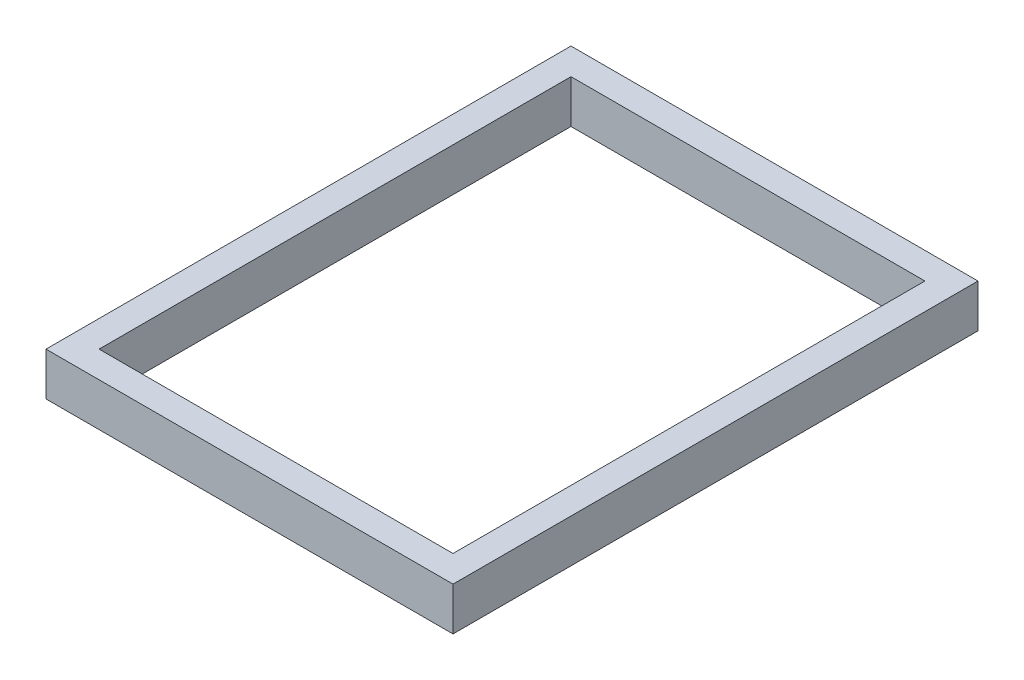
ISO-10303-21;
HEADER;
FILE_DESCRIPTION(('STEP AP214'),'2;1');
FILE_NAME('part.step','',(''),(''),'','','');
FILE_SCHEMA(('AUTOMOTIVE_DESIGN { 1 0 10303 214 1 1 1 1 }'));
ENDSEC;
DATA;
#1=APPLICATION_CONTEXT('core data for automotive mechanical design processes');
#2=APPLICATION_PROTOCOL_DEFINITION('international standard','automotive_design',2000,#1);
#3=PRODUCT_CONTEXT('',#1,'mechanical');
#4=PRODUCT('Part','Part','',(#3));
#5=PRODUCT_RELATED_PRODUCT_CATEGORY('part','',(#4));
#6=PRODUCT_DEFINITION_FORMATION('','',#4);
#7=PRODUCT_DEFINITION_CONTEXT('part definition',#1,'design');
#8=PRODUCT_DEFINITION('design','',#6,#7);
#9=PRODUCT_DEFINITION_SHAPE('','',#8);
#10=(LENGTH_UNIT() NAMED_UNIT(*) SI_UNIT(.MILLI.,.METRE.));
#11=(NAMED_UNIT(*) PLANE_ANGLE_UNIT() SI_UNIT($,.RADIAN.));
#12=(NAMED_UNIT(*) SI_UNIT($,.STERADIAN.) SOLID_ANGLE_UNIT());
#13=UNCERTAINTY_MEASURE_WITH_UNIT(LENGTH_MEASURE(1.E-05),#10,'distance_accuracy_value','');
#14=(GEOMETRIC_REPRESENTATION_CONTEXT(3) GLOBAL_UNCERTAINTY_ASSIGNED_CONTEXT((#13)) GLOBAL_UNIT_ASSIGNED_CONTEXT((#10,
#11,#12)) REPRESENTATION_CONTEXT('',''));
#15=CARTESIAN_POINT('',(0.,0.,0.));
#16=DIRECTION('',(0.,0.,1.));
#17=DIRECTION('',(1.,0.,0.));
#18=AXIS2_PLACEMENT_3D('',#15,#16,#17);
#19=CARTESIAN_POINT('',(0.,39.7764,-107.315));
#20=DIRECTION('',(0.,0.,1.));
#21=DIRECTION('',(1.,0.,0.));
#22=AXIS2_PLACEMENT_3D('',#19,#20,#21);
#23=PLANE('',#22);
#24=DIRECTION('',(-1.,0.,0.));
#25=VECTOR('',#24,1.);
#26=CARTESIAN_POINT('',(0.,30.48,-107.315));
#27=LINE('',#26,#25);
#28=CARTESIAN_POINT('',(81.915,30.48,-107.315));
#29=VERTEX_POINT('',#28);
#30=CARTESIAN_POINT('',(-5.71500000000001,30.48,-107.315));
#31=VERTEX_POINT('',#30);
#32=EDGE_CURVE('E143',#29,#31,#27,.T.);
#33=ORIENTED_EDGE('',*,*,#32,.T.);
#34=DIRECTION('',(0.,-1.,0.));
#35=VECTOR('',#34,1.);
#36=CARTESIAN_POINT('',(-5.71500000000001,39.7764,-107.315));
#37=LINE('',#36,#35);
#38=CARTESIAN_POINT('',(-5.71500000000001,39.7764,-107.315));
#39=VERTEX_POINT('',#38);
#40=EDGE_CURVE('E11',#39,#31,#37,.T.);
#41=ORIENTED_EDGE('',*,*,#40,.F.);
#42=DIRECTION('',(-1.,0.,0.));
#43=VECTOR('',#42,1.);
#44=CARTESIAN_POINT('',(0.,39.7764,-107.315));
#45=LINE('',#44,#43);
#46=CARTESIAN_POINT('',(81.915,39.7764,-107.315));
#47=VERTEX_POINT('',#46);
#48=EDGE_CURVE('E120',#47,#39,#45,.T.);
#49=ORIENTED_EDGE('',*,*,#48,.F.);
#50=DIRECTION('',(0.,-1.,0.));
#51=VECTOR('',#50,1.);
#52=CARTESIAN_POINT('',(81.915,39.7764,-107.315));
#53=LINE('',#52,#51);
#54=EDGE_CURVE('E150',#47,#29,#53,.T.);
#55=ORIENTED_EDGE('',*,*,#54,.T.);
#56=EDGE_LOOP('',(#33,#41,#49,#55));
#57=FACE_BOUND('',#56,.T.);
#58=ADVANCED_FACE('F38',(#57),#23,.F.);
#59=CARTESIAN_POINT('',(-5.715,39.7764,0.));
#60=DIRECTION('',(1.,0.,0.));
#61=DIRECTION('',(0.,0.,-1.));
#62=AXIS2_PLACEMENT_3D('',#59,#60,#61);
#63=PLANE('',#62);
#64=DIRECTION('',(0.,0.,1.));
#65=VECTOR('',#64,1.);
#66=CARTESIAN_POINT('',(-5.715,30.48,0.));
#67=LINE('',#66,#65);
#68=CARTESIAN_POINT('',(-5.715,30.48,5.715));
#69=VERTEX_POINT('',#68);
#70=EDGE_CURVE('E125',#31,#69,#67,.T.);
#71=ORIENTED_EDGE('',*,*,#70,.T.);
#72=DIRECTION('',(0.,-1.,0.));
#73=VECTOR('',#72,1.);
#74=CARTESIAN_POINT('',(-5.715,39.7764,5.715));
#75=LINE('',#74,#73);
#76=CARTESIAN_POINT('',(-5.715,39.7764,5.715));
#77=VERTEX_POINT('',#76);
#78=EDGE_CURVE('E48',#77,#69,#75,.T.);
#79=ORIENTED_EDGE('',*,*,#78,.F.);
#80=DIRECTION('',(0.,0.,1.));
#81=VECTOR('',#80,1.);
#82=CARTESIAN_POINT('',(-5.715,39.7764,0.));
#83=LINE('',#82,#81);
#84=EDGE_CURVE('E114',#39,#77,#83,.T.);
#85=ORIENTED_EDGE('',*,*,#84,.F.);
#86=ORIENTED_EDGE('',*,*,#40,.T.);
#87=EDGE_LOOP('',(#71,#79,#85,#86));
#88=FACE_BOUND('',#87,.T.);
#89=ADVANCED_FACE('F124',(#88),#63,.F.);
#90=CARTESIAN_POINT('',(0.,39.7764,5.715));
#91=DIRECTION('',(0.,0.,-1.));
#92=DIRECTION('',(-1.,0.,0.));
#93=AXIS2_PLACEMENT_3D('',#90,#91,#92);
#94=PLANE('',#93);
#95=DIRECTION('',(1.,0.,0.));
#96=VECTOR('',#95,1.);
#97=CARTESIAN_POINT('',(0.,30.48,5.715));
#98=LINE('',#97,#96);
#99=CARTESIAN_POINT('',(81.915,30.48,5.715));
#100=VERTEX_POINT('',#99);
#101=EDGE_CURVE('E86',#69,#100,#98,.T.);
#102=ORIENTED_EDGE('',*,*,#101,.T.);
#103=DIRECTION('',(0.,-1.,0.));
#104=VECTOR('',#103,1.);
#105=CARTESIAN_POINT('',(81.915,39.7764,5.715));
#106=LINE('',#105,#104);
#107=CARTESIAN_POINT('',(81.915,39.7764,5.715));
#108=VERTEX_POINT('',#107);
#109=EDGE_CURVE('E126',#108,#100,#106,.T.);
#110=ORIENTED_EDGE('',*,*,#109,.F.);
#111=DIRECTION('',(1.,0.,0.));
#112=VECTOR('',#111,1.);
#113=CARTESIAN_POINT('',(0.,39.7764,5.715));
#114=LINE('',#113,#112);
#115=EDGE_CURVE('E118',#77,#108,#114,.T.);
#116=ORIENTED_EDGE('',*,*,#115,.F.);
#117=ORIENTED_EDGE('',*,*,#78,.T.);
#118=EDGE_LOOP('',(#102,#110,#116,#117));
#119=FACE_BOUND('',#118,.T.);
#120=ADVANCED_FACE('F128',(#119),#94,.F.);
#121=CARTESIAN_POINT('',(0.,39.7764,0.));
#122=DIRECTION('',(-1.,0.,0.));
#123=DIRECTION('',(0.,0.,1.));
#124=AXIS2_PLACEMENT_3D('',#121,#122,#123);
#125=PLANE('',#124);
#126=DIRECTION('',(0.,0.,-1.));
#127=VECTOR('',#126,1.);
#128=CARTESIAN_POINT('',(0.,30.48,0.));
#129=LINE('',#128,#127);
#130=CARTESIAN_POINT('',(0.,30.48,0.));
#131=VERTEX_POINT('',#130);
#132=CARTESIAN_POINT('',(0.,30.48,-101.6));
#133=VERTEX_POINT('',#132);
#134=EDGE_CURVE('E134',#131,#133,#129,.T.);
#135=ORIENTED_EDGE('',*,*,#134,.T.);
#136=DIRECTION('',(0.,-1.,0.));
#137=VECTOR('',#136,1.);
#138=CARTESIAN_POINT('',(0.,39.7764,-101.6));
#139=LINE('',#138,#137);
#140=CARTESIAN_POINT('',(0.,39.7764,-101.6));
#141=VERTEX_POINT('',#140);
#142=EDGE_CURVE('E42',#141,#133,#139,.T.);
#143=ORIENTED_EDGE('',*,*,#142,.F.);
#144=DIRECTION('',(0.,0.,-1.));
#145=VECTOR('',#144,1.);
#146=CARTESIAN_POINT('',(0.,39.7764,0.));
#147=LINE('',#146,#145);
#148=CARTESIAN_POINT('',(0.,39.7764,0.));
#149=VERTEX_POINT('',#148);
#150=EDGE_CURVE('E149',#149,#141,#147,.T.);
#151=ORIENTED_EDGE('',*,*,#150,.F.);
#152=DIRECTION('',(0.,-1.,0.));
#153=VECTOR('',#152,1.);
#154=CARTESIAN_POINT('',(0.,39.7764,0.));
#155=LINE('',#154,#153);
#156=EDGE_CURVE('E130',#149,#131,#155,.T.);
#157=ORIENTED_EDGE('',*,*,#156,.T.);
#158=EDGE_LOOP('',(#135,#143,#151,#157));
#159=FACE_BOUND('',#158,.T.);
#160=ADVANCED_FACE('F40',(#159),#125,.F.);
#161=CARTESIAN_POINT('',(0.,39.7764,-101.6));
#162=DIRECTION('',(0.,0.,-1.));
#163=DIRECTION('',(-1.,0.,0.));
#164=AXIS2_PLACEMENT_3D('',#161,#162,#163);
#165=PLANE('',#164);
#166=DIRECTION('',(1.,0.,0.));
#167=VECTOR('',#166,1.);
#168=CARTESIAN_POINT('',(0.,30.48,-101.6));
#169=LINE('',#168,#167);
#170=CARTESIAN_POINT('',(76.2,30.48,-101.6));
#171=VERTEX_POINT('',#170);
#172=EDGE_CURVE('E137',#133,#171,#169,.T.);
#173=ORIENTED_EDGE('',*,*,#172,.T.);
#174=DIRECTION('',(0.,-1.,0.));
#175=VECTOR('',#174,1.);
#176=CARTESIAN_POINT('',(76.2,39.7764,-101.6));
#177=LINE('',#176,#175);
#178=CARTESIAN_POINT('',(76.2,39.7764,-101.6));
#179=VERTEX_POINT('',#178);
#180=EDGE_CURVE('E157',#179,#171,#177,.T.);
#181=ORIENTED_EDGE('',*,*,#180,.F.);
#182=DIRECTION('',(1.,0.,0.));
#183=VECTOR('',#182,1.);
#184=CARTESIAN_POINT('',(0.,39.7764,-101.6));
#185=LINE('',#184,#183);
#186=EDGE_CURVE('E101',#141,#179,#185,.T.);
#187=ORIENTED_EDGE('',*,*,#186,.F.);
#188=ORIENTED_EDGE('',*,*,#142,.T.);
#189=EDGE_LOOP('',(#173,#181,#187,#188));
#190=FACE_BOUND('',#189,.T.);
#191=ADVANCED_FACE('F163',(#190),#165,.F.);
#192=CARTESIAN_POINT('',(76.2,39.7764,0.));
#193=DIRECTION('',(1.,0.,0.));
#194=DIRECTION('',(0.,0.,-1.));
#195=AXIS2_PLACEMENT_3D('',#192,#193,#194);
#196=PLANE('',#195);
#197=DIRECTION('',(0.,0.,1.));
#198=VECTOR('',#197,1.);
#199=CARTESIAN_POINT('',(76.2,30.48,0.));
#200=LINE('',#199,#198);
#201=CARTESIAN_POINT('',(76.2,30.48,0.));
#202=VERTEX_POINT('',#201);
#203=EDGE_CURVE('E139',#171,#202,#200,.T.);
#204=ORIENTED_EDGE('',*,*,#203,.T.);
#205=DIRECTION('',(0.,-1.,0.));
#206=VECTOR('',#205,1.);
#207=CARTESIAN_POINT('',(76.2,39.7764,0.));
#208=LINE('',#207,#206);
#209=CARTESIAN_POINT('',(76.2,39.7764,0.));
#210=VERTEX_POINT('',#209);
#211=EDGE_CURVE('E155',#210,#202,#208,.T.);
#212=ORIENTED_EDGE('',*,*,#211,.F.);
#213=DIRECTION('',(0.,0.,1.));
#214=VECTOR('',#213,1.);
#215=CARTESIAN_POINT('',(76.2,39.7764,0.));
#216=LINE('',#215,#214);
#217=EDGE_CURVE('E179',#179,#210,#216,.T.);
#218=ORIENTED_EDGE('',*,*,#217,.F.);
#219=ORIENTED_EDGE('',*,*,#180,.T.);
#220=EDGE_LOOP('',(#204,#212,#218,#219));
#221=FACE_BOUND('',#220,.T.);
#222=ADVANCED_FACE('F173',(#221),#196,.F.);
#223=CARTESIAN_POINT('',(0.,39.7764,0.));
#224=DIRECTION('',(0.,0.,1.));
#225=DIRECTION('',(1.,0.,0.));
#226=AXIS2_PLACEMENT_3D('',#223,#224,#225);
#227=PLANE('',#226);
#228=DIRECTION('',(-1.,0.,0.));
#229=VECTOR('',#228,1.);
#230=CARTESIAN_POINT('',(0.,30.48,0.));
#231=LINE('',#230,#229);
#232=EDGE_CURVE('E141',#202,#131,#231,.T.);
#233=ORIENTED_EDGE('',*,*,#232,.T.);
#234=ORIENTED_EDGE('',*,*,#156,.F.);
#235=DIRECTION('',(-1.,0.,0.));
#236=VECTOR('',#235,1.);
#237=CARTESIAN_POINT('',(0.,39.7764,0.));
#238=LINE('',#237,#236);
#239=EDGE_CURVE('E177',#210,#149,#238,.T.);
#240=ORIENTED_EDGE('',*,*,#239,.F.);
#241=ORIENTED_EDGE('',*,*,#211,.T.);
#242=EDGE_LOOP('',(#233,#234,#240,#241));
#243=FACE_BOUND('',#242,.T.);
#244=ADVANCED_FACE('F176',(#243),#227,.F.);
#245=CARTESIAN_POINT('',(81.915,39.7764,0.));
#246=DIRECTION('',(-1.,0.,0.));
#247=DIRECTION('',(0.,0.,1.));
#248=AXIS2_PLACEMENT_3D('',#245,#246,#247);
#249=PLANE('',#248);
#250=DIRECTION('',(0.,0.,-1.));
#251=VECTOR('',#250,1.);
#252=CARTESIAN_POINT('',(81.915,30.48,0.));
#253=LINE('',#252,#251);
#254=EDGE_CURVE('E92',#100,#29,#253,.T.);
#255=ORIENTED_EDGE('',*,*,#254,.T.);
#256=ORIENTED_EDGE('',*,*,#54,.F.);
#257=DIRECTION('',(0.,0.,-1.));
#258=VECTOR('',#257,1.);
#259=CARTESIAN_POINT('',(81.915,39.7764,0.));
#260=LINE('',#259,#258);
#261=EDGE_CURVE('E57',#108,#47,#260,.T.);
#262=ORIENTED_EDGE('',*,*,#261,.F.);
#263=ORIENTED_EDGE('',*,*,#109,.T.);
#264=EDGE_LOOP('',(#255,#256,#262,#263));
#265=FACE_BOUND('',#264,.T.);
#266=ADVANCED_FACE('F185',(#265),#249,.F.);
#267=CARTESIAN_POINT('',(0.,39.7764,0.));
#268=DIRECTION('',(0.,1.,0.));
#269=DIRECTION('',(0.,0.,1.));
#270=AXIS2_PLACEMENT_3D('',#267,#268,#269);
#271=PLANE('',#270);
#272=ORIENTED_EDGE('',*,*,#150,.T.);
#273=ORIENTED_EDGE('',*,*,#186,.T.);
#274=ORIENTED_EDGE('',*,*,#217,.T.);
#275=ORIENTED_EDGE('',*,*,#239,.T.);
#276=EDGE_LOOP('',(#272,#273,#274,#275));
#277=FACE_BOUND('',#276,.T.);
#278=ORIENTED_EDGE('',*,*,#48,.T.);
#279=ORIENTED_EDGE('',*,*,#84,.T.);
#280=ORIENTED_EDGE('',*,*,#115,.T.);
#281=ORIENTED_EDGE('',*,*,#261,.T.);
#282=EDGE_LOOP('',(#278,#279,#280,#281));
#283=FACE_BOUND('',#282,.T.);
#284=ADVANCED_FACE('F116',(#277,#283),#271,.T.);
#285=CARTESIAN_POINT('',(0.,30.48,0.));
#286=DIRECTION('',(0.,1.,0.));
#287=DIRECTION('',(0.,0.,1.));
#288=AXIS2_PLACEMENT_3D('',#285,#286,#287);
#289=PLANE('',#288);
#290=ORIENTED_EDGE('',*,*,#134,.F.);
#291=ORIENTED_EDGE('',*,*,#232,.F.);
#292=ORIENTED_EDGE('',*,*,#203,.F.);
#293=ORIENTED_EDGE('',*,*,#172,.F.);
#294=EDGE_LOOP('',(#290,#291,#292,#293));
#295=FACE_BOUND('',#294,.T.);
#296=ORIENTED_EDGE('',*,*,#32,.F.);
#297=ORIENTED_EDGE('',*,*,#254,.F.);
#298=ORIENTED_EDGE('',*,*,#101,.F.);
#299=ORIENTED_EDGE('',*,*,#70,.F.);
#300=EDGE_LOOP('',(#296,#297,#298,#299));
#301=FACE_BOUND('',#300,.T.);
#302=ADVANCED_FACE('F170',(#295,#301),#289,.F.);
#303=CLOSED_SHELL('',(#58,#89,#120,#160,#191,#222,#244,#266,#284,#302));
#304=MANIFOLD_SOLID_BREP('B2',#303);
#305=ADVANCED_BREP_SHAPE_REPRESENTATION('',(#18,#304),#14);
#306=SHAPE_DEFINITION_REPRESENTATION(#9,#305);
ENDSEC;
END-ISO-10303-21;
